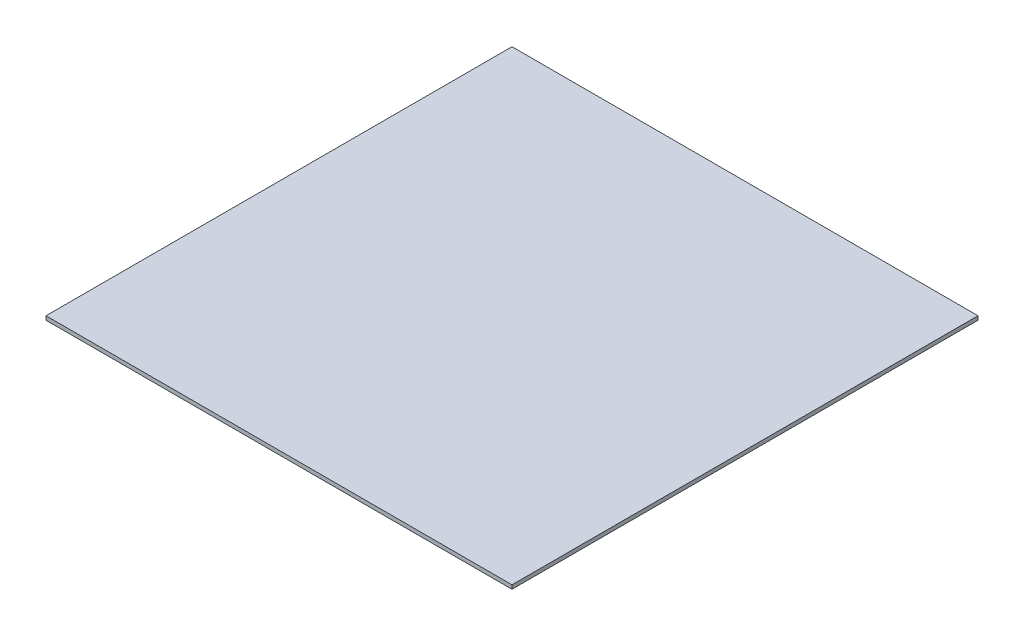
ISO-10303-21;
HEADER;
FILE_DESCRIPTION(('STEP AP214'),'2;1');
FILE_NAME('part.step','',(''),(''),'','','');
FILE_SCHEMA(('AUTOMOTIVE_DESIGN { 1 0 10303 214 1 1 1 1 }'));
ENDSEC;
DATA;
#1=APPLICATION_CONTEXT('core data for automotive mechanical design processes');
#2=APPLICATION_PROTOCOL_DEFINITION('international standard','automotive_design',2000,#1);
#3=PRODUCT_CONTEXT('',#1,'mechanical');
#4=PRODUCT('Part','Part','',(#3));
#5=PRODUCT_RELATED_PRODUCT_CATEGORY('part','',(#4));
#6=PRODUCT_DEFINITION_FORMATION('','',#4);
#7=PRODUCT_DEFINITION_CONTEXT('part definition',#1,'design');
#8=PRODUCT_DEFINITION('design','',#6,#7);
#9=PRODUCT_DEFINITION_SHAPE('','',#8);
#10=(LENGTH_UNIT() NAMED_UNIT(*) SI_UNIT(.MILLI.,.METRE.));
#11=(NAMED_UNIT(*) PLANE_ANGLE_UNIT() SI_UNIT($,.RADIAN.));
#12=(NAMED_UNIT(*) SI_UNIT($,.STERADIAN.) SOLID_ANGLE_UNIT());
#13=UNCERTAINTY_MEASURE_WITH_UNIT(LENGTH_MEASURE(1.E-05),#10,'distance_accuracy_value','');
#14=(GEOMETRIC_REPRESENTATION_CONTEXT(3) GLOBAL_UNCERTAINTY_ASSIGNED_CONTEXT((#13)) GLOBAL_UNIT_ASSIGNED_CONTEXT((#10,
#11,#12)) REPRESENTATION_CONTEXT('',''));
#15=CARTESIAN_POINT('',(0.,0.,0.));
#16=DIRECTION('',(0.,0.,1.));
#17=DIRECTION('',(1.,0.,0.));
#18=AXIS2_PLACEMENT_3D('',#15,#16,#17);
#19=CARTESIAN_POINT('',(-32.2394245165731,3.175,-74.2087654413012));
#20=DIRECTION('',(1.,0.,0.));
#21=DIRECTION('',(0.,0.,-1.));
#22=AXIS2_PLACEMENT_3D('',#19,#20,#21);
#23=PLANE('',#22);
#24=DIRECTION('',(0.,0.,1.));
#25=VECTOR('',#24,1.);
#26=CARTESIAN_POINT('',(-32.2394245165731,0.,-74.2087654413012));
#27=LINE('',#26,#25);
#28=CARTESIAN_POINT('',(-32.2394245165731,0.,-74.2087654413012));
#29=VERTEX_POINT('',#28);
#30=CARTESIAN_POINT('',(-32.2394245165731,0.,306.791234558699));
#31=VERTEX_POINT('',#30);
#32=EDGE_CURVE('E96',#29,#31,#27,.T.);
#33=ORIENTED_EDGE('',*,*,#32,.T.);
#34=DIRECTION('',(0.,-1.,0.));
#35=VECTOR('',#34,1.);
#36=CARTESIAN_POINT('',(-32.2394245165731,3.175,306.791234558699));
#37=LINE('',#36,#35);
#38=CARTESIAN_POINT('',(-32.2394245165731,3.175,306.791234558699));
#39=VERTEX_POINT('',#38);
#40=EDGE_CURVE('E11',#39,#31,#37,.T.);
#41=ORIENTED_EDGE('',*,*,#40,.F.);
#42=DIRECTION('',(0.,0.,1.));
#43=VECTOR('',#42,1.);
#44=CARTESIAN_POINT('',(-32.2394245165731,3.175,-74.2087654413012));
#45=LINE('',#44,#43);
#46=CARTESIAN_POINT('',(-32.2394245165731,3.175,-74.2087654413012));
#47=VERTEX_POINT('',#46);
#48=EDGE_CURVE('E84',#47,#39,#45,.T.);
#49=ORIENTED_EDGE('',*,*,#48,.F.);
#50=DIRECTION('',(0.,-1.,0.));
#51=VECTOR('',#50,1.);
#52=CARTESIAN_POINT('',(-32.2394245165731,3.175,-74.2087654413012));
#53=LINE('',#52,#51);
#54=EDGE_CURVE('E92',#47,#29,#53,.T.);
#55=ORIENTED_EDGE('',*,*,#54,.T.);
#56=EDGE_LOOP('',(#33,#41,#49,#55));
#57=FACE_BOUND('',#56,.T.);
#58=ADVANCED_FACE('F33',(#57),#23,.F.);
#59=CARTESIAN_POINT('',(-32.2394245165731,3.175,306.791234558699));
#60=DIRECTION('',(0.,0.,-1.));
#61=DIRECTION('',(-1.,0.,0.));
#62=AXIS2_PLACEMENT_3D('',#59,#60,#61);
#63=PLANE('',#62);
#64=DIRECTION('',(1.,0.,0.));
#65=VECTOR('',#64,1.);
#66=CARTESIAN_POINT('',(-32.2394245165731,0.,306.791234558699));
#67=LINE('',#66,#65);
#68=CARTESIAN_POINT('',(348.760575483427,0.,306.791234558699));
#69=VERTEX_POINT('',#68);
#70=EDGE_CURVE('E88',#31,#69,#67,.T.);
#71=ORIENTED_EDGE('',*,*,#70,.T.);
#72=DIRECTION('',(0.,-1.,0.));
#73=VECTOR('',#72,1.);
#74=CARTESIAN_POINT('',(348.760575483427,3.175,306.791234558699));
#75=LINE('',#74,#73);
#76=CARTESIAN_POINT('',(348.760575483427,3.175,306.791234558699));
#77=VERTEX_POINT('',#76);
#78=EDGE_CURVE('E41',#77,#69,#75,.T.);
#79=ORIENTED_EDGE('',*,*,#78,.F.);
#80=DIRECTION('',(1.,0.,0.));
#81=VECTOR('',#80,1.);
#82=CARTESIAN_POINT('',(-32.2394245165731,3.175,306.791234558699));
#83=LINE('',#82,#81);
#84=EDGE_CURVE('E79',#39,#77,#83,.T.);
#85=ORIENTED_EDGE('',*,*,#84,.F.);
#86=ORIENTED_EDGE('',*,*,#40,.T.);
#87=EDGE_LOOP('',(#71,#79,#85,#86));
#88=FACE_BOUND('',#87,.T.);
#89=ADVANCED_FACE('F87',(#88),#63,.F.);
#90=CARTESIAN_POINT('',(348.760575483427,3.175,-74.2087654413012));
#91=DIRECTION('',(-1.,0.,0.));
#92=DIRECTION('',(0.,0.,1.));
#93=AXIS2_PLACEMENT_3D('',#90,#91,#92);
#94=PLANE('',#93);
#95=DIRECTION('',(0.,0.,-1.));
#96=VECTOR('',#95,1.);
#97=CARTESIAN_POINT('',(348.760575483427,0.,-74.2087654413012));
#98=LINE('',#97,#96);
#99=CARTESIAN_POINT('',(348.760575483427,0.,-74.2087654413012));
#100=VERTEX_POINT('',#99);
#101=EDGE_CURVE('E66',#69,#100,#98,.T.);
#102=ORIENTED_EDGE('',*,*,#101,.T.);
#103=DIRECTION('',(0.,-1.,0.));
#104=VECTOR('',#103,1.);
#105=CARTESIAN_POINT('',(348.760575483427,3.175,-74.2087654413012));
#106=LINE('',#105,#104);
#107=CARTESIAN_POINT('',(348.760575483427,3.175,-74.2087654413012));
#108=VERTEX_POINT('',#107);
#109=EDGE_CURVE('E89',#108,#100,#106,.T.);
#110=ORIENTED_EDGE('',*,*,#109,.F.);
#111=DIRECTION('',(0.,0.,-1.));
#112=VECTOR('',#111,1.);
#113=CARTESIAN_POINT('',(348.760575483427,3.175,-74.2087654413012));
#114=LINE('',#113,#112);
#115=EDGE_CURVE('E82',#77,#108,#114,.T.);
#116=ORIENTED_EDGE('',*,*,#115,.F.);
#117=ORIENTED_EDGE('',*,*,#78,.T.);
#118=EDGE_LOOP('',(#102,#110,#116,#117));
#119=FACE_BOUND('',#118,.T.);
#120=ADVANCED_FACE('F90',(#119),#94,.F.);
#121=CARTESIAN_POINT('',(-32.2394245165731,3.175,-74.2087654413012));
#122=DIRECTION('',(0.,0.,1.));
#123=DIRECTION('',(1.,0.,0.));
#124=AXIS2_PLACEMENT_3D('',#121,#122,#123);
#125=PLANE('',#124);
#126=DIRECTION('',(-1.,0.,0.));
#127=VECTOR('',#126,1.);
#128=CARTESIAN_POINT('',(-32.2394245165731,0.,-74.2087654413012));
#129=LINE('',#128,#127);
#130=EDGE_CURVE('E72',#100,#29,#129,.T.);
#131=ORIENTED_EDGE('',*,*,#130,.T.);
#132=ORIENTED_EDGE('',*,*,#54,.F.);
#133=DIRECTION('',(-1.,0.,0.));
#134=VECTOR('',#133,1.);
#135=CARTESIAN_POINT('',(-32.2394245165731,3.175,-74.2087654413012));
#136=LINE('',#135,#134);
#137=EDGE_CURVE('E49',#108,#47,#136,.T.);
#138=ORIENTED_EDGE('',*,*,#137,.F.);
#139=ORIENTED_EDGE('',*,*,#109,.T.);
#140=EDGE_LOOP('',(#131,#132,#138,#139));
#141=FACE_BOUND('',#140,.T.);
#142=ADVANCED_FACE('F103',(#141),#125,.F.);
#143=CARTESIAN_POINT('',(0.,3.175,0.));
#144=DIRECTION('',(0.,1.,0.));
#145=DIRECTION('',(0.,0.,1.));
#146=AXIS2_PLACEMENT_3D('',#143,#144,#145);
#147=PLANE('',#146);
#148=ORIENTED_EDGE('',*,*,#48,.T.);
#149=ORIENTED_EDGE('',*,*,#84,.T.);
#150=ORIENTED_EDGE('',*,*,#115,.T.);
#151=ORIENTED_EDGE('',*,*,#137,.T.);
#152=EDGE_LOOP('',(#148,#149,#150,#151));
#153=FACE_BOUND('',#152,.T.);
#154=ADVANCED_FACE('F80',(#153),#147,.T.);
#155=CARTESIAN_POINT('',(0.,0.,0.));
#156=DIRECTION('',(0.,1.,0.));
#157=DIRECTION('',(0.,0.,1.));
#158=AXIS2_PLACEMENT_3D('',#155,#156,#157);
#159=PLANE('',#158);
#160=ORIENTED_EDGE('',*,*,#32,.F.);
#161=ORIENTED_EDGE('',*,*,#130,.F.);
#162=ORIENTED_EDGE('',*,*,#101,.F.);
#163=ORIENTED_EDGE('',*,*,#70,.F.);
#164=EDGE_LOOP('',(#160,#161,#162,#163));
#165=FACE_BOUND('',#164,.T.);
#166=ADVANCED_FACE('F106',(#165),#159,.F.);
#167=CLOSED_SHELL('',(#58,#89,#120,#142,#154,#166));
#168=MANIFOLD_SOLID_BREP('B2',#167);
#169=ADVANCED_BREP_SHAPE_REPRESENTATION('',(#18,#168),#14);
#170=SHAPE_DEFINITION_REPRESENTATION(#9,#169);
ENDSEC;
END-ISO-10303-21;
